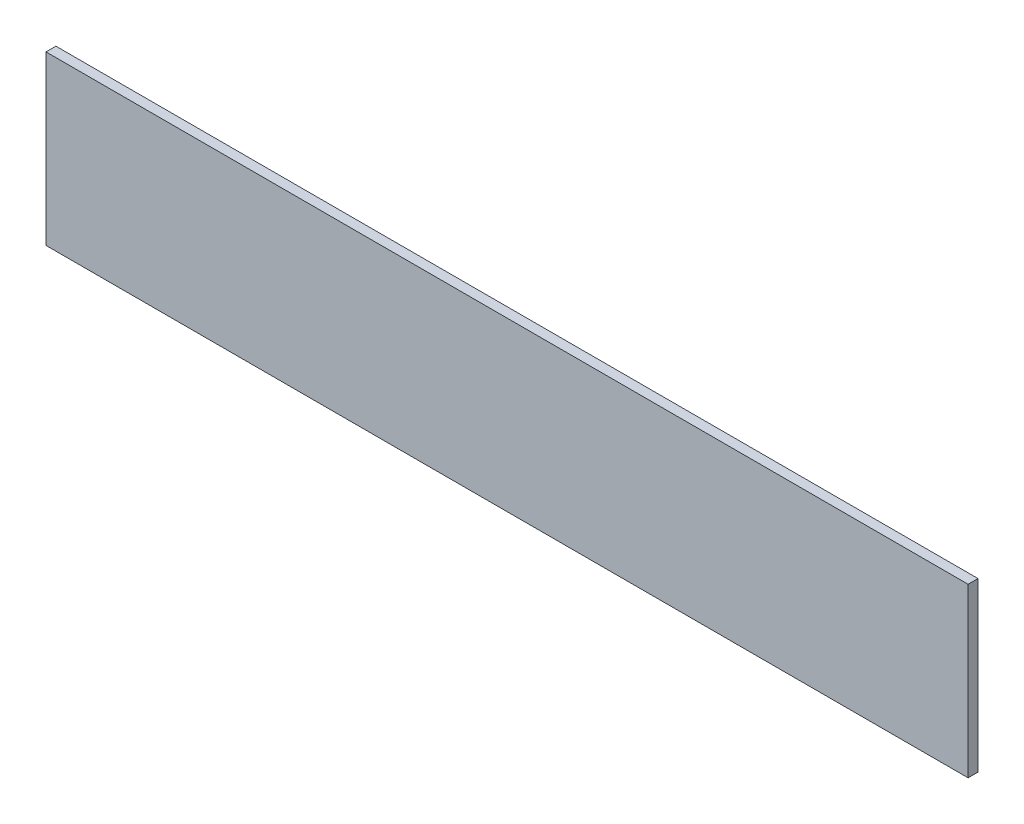
ISO-10303-21;
HEADER;
FILE_DESCRIPTION(('STEP AP214'),'2;1');
FILE_NAME('part.step','',(''),(''),'','','');
FILE_SCHEMA(('AUTOMOTIVE_DESIGN { 1 0 10303 214 1 1 1 1 }'));
ENDSEC;
DATA;
#1=APPLICATION_CONTEXT('core data for automotive mechanical design processes');
#2=APPLICATION_PROTOCOL_DEFINITION('international standard','automotive_design',2000,#1);
#3=PRODUCT_CONTEXT('',#1,'mechanical');
#4=PRODUCT('Part','Part','',(#3));
#5=PRODUCT_RELATED_PRODUCT_CATEGORY('part','',(#4));
#6=PRODUCT_DEFINITION_FORMATION('','',#4);
#7=PRODUCT_DEFINITION_CONTEXT('part definition',#1,'design');
#8=PRODUCT_DEFINITION('design','',#6,#7);
#9=PRODUCT_DEFINITION_SHAPE('','',#8);
#10=(LENGTH_UNIT() NAMED_UNIT(*) SI_UNIT(.MILLI.,.METRE.));
#11=(NAMED_UNIT(*) PLANE_ANGLE_UNIT() SI_UNIT($,.RADIAN.));
#12=(NAMED_UNIT(*) SI_UNIT($,.STERADIAN.) SOLID_ANGLE_UNIT());
#13=UNCERTAINTY_MEASURE_WITH_UNIT(LENGTH_MEASURE(1.E-05),#10,'distance_accuracy_value','');
#14=(GEOMETRIC_REPRESENTATION_CONTEXT(3) GLOBAL_UNCERTAINTY_ASSIGNED_CONTEXT((#13)) GLOBAL_UNIT_ASSIGNED_CONTEXT((#10,
#11,#12)) REPRESENTATION_CONTEXT('',''));
#15=CARTESIAN_POINT('',(0.,0.,0.));
#16=DIRECTION('',(0.,0.,1.));
#17=DIRECTION('',(1.,0.,0.));
#18=AXIS2_PLACEMENT_3D('',#15,#16,#17);
#19=CARTESIAN_POINT('',(0.,0.,3.));
#20=DIRECTION('',(1.,0.,0.));
#21=DIRECTION('',(0.,0.,-1.));
#22=AXIS2_PLACEMENT_3D('',#19,#20,#21);
#23=PLANE('',#22);
#24=DIRECTION('',(0.,-1.,0.));
#25=VECTOR('',#24,1.);
#26=CARTESIAN_POINT('',(0.,0.,0.));
#27=LINE('',#26,#25);
#28=CARTESIAN_POINT('',(0.,50.8,0.));
#29=VERTEX_POINT('',#28);
#30=CARTESIAN_POINT('',(0.,0.,0.));
#31=VERTEX_POINT('',#30);
#32=EDGE_CURVE('E107',#29,#31,#27,.T.);
#33=ORIENTED_EDGE('',*,*,#32,.T.);
#34=DIRECTION('',(0.,0.,-1.));
#35=VECTOR('',#34,1.);
#36=CARTESIAN_POINT('',(0.,0.,3.));
#37=LINE('',#36,#35);
#38=CARTESIAN_POINT('',(0.,0.,3.));
#39=VERTEX_POINT('',#38);
#40=EDGE_CURVE('E11',#39,#31,#37,.T.);
#41=ORIENTED_EDGE('',*,*,#40,.F.);
#42=DIRECTION('',(0.,-1.,0.));
#43=VECTOR('',#42,1.);
#44=CARTESIAN_POINT('',(0.,0.,3.));
#45=LINE('',#44,#43);
#46=CARTESIAN_POINT('',(0.,50.8,3.));
#47=VERTEX_POINT('',#46);
#48=EDGE_CURVE('E91',#47,#39,#45,.T.);
#49=ORIENTED_EDGE('',*,*,#48,.F.);
#50=DIRECTION('',(0.,0.,-1.));
#51=VECTOR('',#50,1.);
#52=CARTESIAN_POINT('',(0.,50.8,3.));
#53=LINE('',#52,#51);
#54=EDGE_CURVE('E103',#47,#29,#53,.T.);
#55=ORIENTED_EDGE('',*,*,#54,.T.);
#56=EDGE_LOOP('',(#33,#41,#49,#55));
#57=FACE_BOUND('',#56,.T.);
#58=ADVANCED_FACE('F39',(#57),#23,.F.);
#59=CARTESIAN_POINT('',(0.,0.,3.));
#60=DIRECTION('',(0.,1.,0.));
#61=DIRECTION('',(0.,0.,1.));
#62=AXIS2_PLACEMENT_3D('',#59,#60,#61);
#63=PLANE('',#62);
#64=DIRECTION('',(1.,0.,0.));
#65=VECTOR('',#64,1.);
#66=CARTESIAN_POINT('',(0.,0.,0.));
#67=LINE('',#66,#65);
#68=CARTESIAN_POINT('',(279.4,0.,0.));
#69=VERTEX_POINT('',#68);
#70=EDGE_CURVE('E96',#31,#69,#67,.T.);
#71=ORIENTED_EDGE('',*,*,#70,.T.);
#72=DIRECTION('',(0.,0.,-1.));
#73=VECTOR('',#72,1.);
#74=CARTESIAN_POINT('',(279.4,0.,3.));
#75=LINE('',#74,#73);
#76=CARTESIAN_POINT('',(279.4,0.,3.));
#77=VERTEX_POINT('',#76);
#78=EDGE_CURVE('E48',#77,#69,#75,.T.);
#79=ORIENTED_EDGE('',*,*,#78,.F.);
#80=DIRECTION('',(1.,0.,0.));
#81=VECTOR('',#80,1.);
#82=CARTESIAN_POINT('',(0.,0.,3.));
#83=LINE('',#82,#81);
#84=EDGE_CURVE('E86',#39,#77,#83,.T.);
#85=ORIENTED_EDGE('',*,*,#84,.F.);
#86=ORIENTED_EDGE('',*,*,#40,.T.);
#87=EDGE_LOOP('',(#71,#79,#85,#86));
#88=FACE_BOUND('',#87,.T.);
#89=ADVANCED_FACE('F95',(#88),#63,.F.);
#90=CARTESIAN_POINT('',(279.4,0.,3.));
#91=DIRECTION('',(-1.,0.,0.));
#92=DIRECTION('',(0.,0.,1.));
#93=AXIS2_PLACEMENT_3D('',#90,#91,#92);
#94=PLANE('',#93);
#95=DIRECTION('',(0.,1.,0.));
#96=VECTOR('',#95,1.);
#97=CARTESIAN_POINT('',(279.4,0.,0.));
#98=LINE('',#97,#96);
#99=CARTESIAN_POINT('',(279.4,50.8,0.));
#100=VERTEX_POINT('',#99);
#101=EDGE_CURVE('E73',#69,#100,#98,.T.);
#102=ORIENTED_EDGE('',*,*,#101,.T.);
#103=DIRECTION('',(0.,0.,-1.));
#104=VECTOR('',#103,1.);
#105=CARTESIAN_POINT('',(279.4,50.8,3.));
#106=LINE('',#105,#104);
#107=CARTESIAN_POINT('',(279.4,50.8,3.));
#108=VERTEX_POINT('',#107);
#109=EDGE_CURVE('E98',#108,#100,#106,.T.);
#110=ORIENTED_EDGE('',*,*,#109,.F.);
#111=DIRECTION('',(0.,1.,0.));
#112=VECTOR('',#111,1.);
#113=CARTESIAN_POINT('',(279.4,0.,3.));
#114=LINE('',#113,#112);
#115=EDGE_CURVE('E89',#77,#108,#114,.T.);
#116=ORIENTED_EDGE('',*,*,#115,.F.);
#117=ORIENTED_EDGE('',*,*,#78,.T.);
#118=EDGE_LOOP('',(#102,#110,#116,#117));
#119=FACE_BOUND('',#118,.T.);
#120=ADVANCED_FACE('F99',(#119),#94,.F.);
#121=CARTESIAN_POINT('',(0.,50.8,3.));
#122=DIRECTION('',(0.,-1.,0.));
#123=DIRECTION('',(0.,0.,-1.));
#124=AXIS2_PLACEMENT_3D('',#121,#122,#123);
#125=PLANE('',#124);
#126=DIRECTION('',(-1.,0.,0.));
#127=VECTOR('',#126,1.);
#128=CARTESIAN_POINT('',(0.,50.8,0.));
#129=LINE('',#128,#127);
#130=EDGE_CURVE('E79',#100,#29,#129,.T.);
#131=ORIENTED_EDGE('',*,*,#130,.T.);
#132=ORIENTED_EDGE('',*,*,#54,.F.);
#133=DIRECTION('',(-1.,0.,0.));
#134=VECTOR('',#133,1.);
#135=CARTESIAN_POINT('',(0.,50.8,3.));
#136=LINE('',#135,#134);
#137=EDGE_CURVE('E56',#108,#47,#136,.T.);
#138=ORIENTED_EDGE('',*,*,#137,.F.);
#139=ORIENTED_EDGE('',*,*,#109,.T.);
#140=EDGE_LOOP('',(#131,#132,#138,#139));
#141=FACE_BOUND('',#140,.T.);
#142=ADVANCED_FACE('F120',(#141),#125,.F.);
#143=CARTESIAN_POINT('',(0.,0.,3.));
#144=DIRECTION('',(0.,0.,-1.));
#145=DIRECTION('',(-1.,0.,0.));
#146=AXIS2_PLACEMENT_3D('',#143,#144,#145);
#147=PLANE('',#146);
#148=ORIENTED_EDGE('',*,*,#48,.T.);
#149=ORIENTED_EDGE('',*,*,#84,.T.);
#150=ORIENTED_EDGE('',*,*,#115,.T.);
#151=ORIENTED_EDGE('',*,*,#137,.T.);
#152=EDGE_LOOP('',(#148,#149,#150,#151));
#153=FACE_BOUND('',#152,.T.);
#154=ADVANCED_FACE('F87',(#153),#147,.F.);
#155=CARTESIAN_POINT('',(0.,0.,0.));
#156=DIRECTION('',(0.,0.,-1.));
#157=DIRECTION('',(-1.,0.,0.));
#158=AXIS2_PLACEMENT_3D('',#155,#156,#157);
#159=PLANE('',#158);
#160=ORIENTED_EDGE('',*,*,#32,.F.);
#161=ORIENTED_EDGE('',*,*,#130,.F.);
#162=ORIENTED_EDGE('',*,*,#101,.F.);
#163=ORIENTED_EDGE('',*,*,#70,.F.);
#164=EDGE_LOOP('',(#160,#161,#162,#163));
#165=FACE_BOUND('',#164,.T.);
#166=ADVANCED_FACE('F123',(#165),#159,.T.);
#167=CLOSED_SHELL('',(#58,#89,#120,#142,#154,#166));
#168=MANIFOLD_SOLID_BREP('B2',#167);
#169=ADVANCED_BREP_SHAPE_REPRESENTATION('',(#18,#168),#14);
#170=SHAPE_DEFINITION_REPRESENTATION(#9,#169);
ENDSEC;
END-ISO-10303-21;
